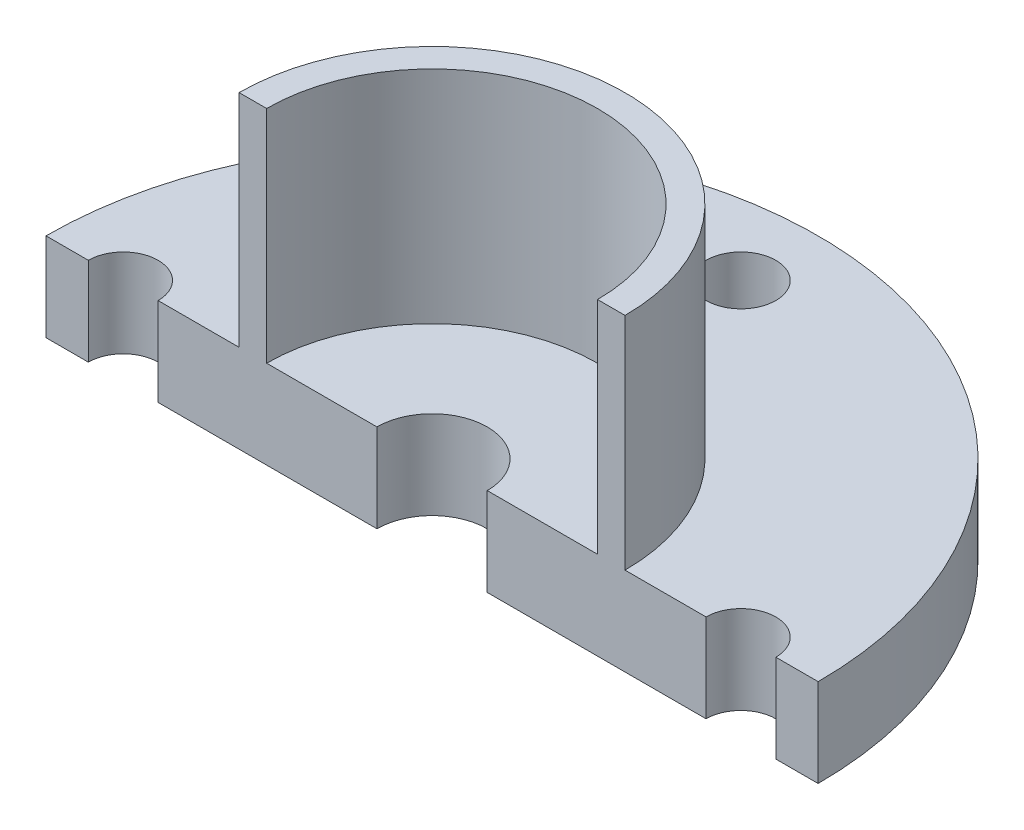
ISO-10303-21;
HEADER;
FILE_DESCRIPTION(('STEP AP214'),'2;1');
FILE_NAME('part.step','',(''),(''),'','','');
FILE_SCHEMA(('AUTOMOTIVE_DESIGN { 1 0 10303 214 1 1 1 1 }'));
ENDSEC;
DATA;
#1=APPLICATION_CONTEXT('core data for automotive mechanical design processes');
#2=APPLICATION_PROTOCOL_DEFINITION('international standard','automotive_design',2000,#1);
#3=PRODUCT_CONTEXT('',#1,'mechanical');
#4=PRODUCT('Part','Part','',(#3));
#5=PRODUCT_RELATED_PRODUCT_CATEGORY('part','',(#4));
#6=PRODUCT_DEFINITION_FORMATION('','',#4);
#7=PRODUCT_DEFINITION_CONTEXT('part definition',#1,'design');
#8=PRODUCT_DEFINITION('design','',#6,#7);
#9=PRODUCT_DEFINITION_SHAPE('','',#8);
#10=(LENGTH_UNIT() NAMED_UNIT(*) SI_UNIT(.MILLI.,.METRE.));
#11=(NAMED_UNIT(*) PLANE_ANGLE_UNIT() SI_UNIT($,.RADIAN.));
#12=(NAMED_UNIT(*) SI_UNIT($,.STERADIAN.) SOLID_ANGLE_UNIT());
#13=UNCERTAINTY_MEASURE_WITH_UNIT(LENGTH_MEASURE(1.E-05),#10,'distance_accuracy_value','');
#14=(GEOMETRIC_REPRESENTATION_CONTEXT(3) GLOBAL_UNCERTAINTY_ASSIGNED_CONTEXT((#13)) GLOBAL_UNIT_ASSIGNED_CONTEXT((#10,
#11,#12)) REPRESENTATION_CONTEXT('',''));
#15=CARTESIAN_POINT('',(0.,0.,0.));
#16=DIRECTION('',(0.,0.,1.));
#17=DIRECTION('',(1.,0.,0.));
#18=AXIS2_PLACEMENT_3D('',#15,#16,#17);
#19=CARTESIAN_POINT('',(0.,8.,0.));
#20=DIRECTION('',(0.,1.,0.));
#21=DIRECTION('',(0.,0.,1.));
#22=AXIS2_PLACEMENT_3D('',#19,#20,#21);
#23=PLANE('',#22);
#24=CARTESIAN_POINT('',(0.,8.,0.));
#25=DIRECTION('',(0.,1.,0.));
#26=DIRECTION('',(0.,0.,1.));
#27=AXIS2_PLACEMENT_3D('',#24,#25,#26);
#28=CIRCLE('',#27,15.);
#29=CARTESIAN_POINT('',(15.,8.,0.));
#30=VERTEX_POINT('',#29);
#31=CARTESIAN_POINT('',(-15.,8.,0.));
#32=VERTEX_POINT('',#31);
#33=EDGE_CURVE('E133',#30,#32,#28,.T.);
#34=ORIENTED_EDGE('',*,*,#33,.T.);
#35=DIRECTION('',(1.,0.,0.));
#36=VECTOR('',#35,1.);
#37=CARTESIAN_POINT('',(0.,8.,0.));
#38=LINE('',#37,#36);
#39=CARTESIAN_POINT('',(-5.,8.,0.));
#40=VERTEX_POINT('',#39);
#41=EDGE_CURVE('E150',#32,#40,#38,.T.);
#42=ORIENTED_EDGE('',*,*,#41,.T.);
#43=CARTESIAN_POINT('',(0.,8.,0.));
#44=DIRECTION('',(0.,1.,0.));
#45=DIRECTION('',(0.,0.,1.));
#46=AXIS2_PLACEMENT_3D('',#43,#44,#45);
#47=CIRCLE('',#46,5.);
#48=CARTESIAN_POINT('',(5.,8.,0.));
#49=VERTEX_POINT('',#48);
#50=EDGE_CURVE('E174',#49,#40,#47,.T.);
#51=ORIENTED_EDGE('',*,*,#50,.F.);
#52=EDGE_CURVE('E180',#49,#30,#38,.T.);
#53=ORIENTED_EDGE('',*,*,#52,.T.);
#54=EDGE_LOOP('',(#34,#42,#51,#53));
#55=FACE_BOUND('',#54,.T.);
#56=ADVANCED_FACE('F34',(#55),#23,.T.);
#57=CARTESIAN_POINT('',(1.95523068222125E-13,8.,-28.));
#58=DIRECTION('',(0.,1.,0.));
#59=DIRECTION('',(0.,0.,1.));
#60=AXIS2_PLACEMENT_3D('',#57,#58,#59);
#61=CIRCLE('',#60,3.16227766016838);
#62=CARTESIAN_POINT('',(1.95523068222125E-13,8.,-24.8377223398316));
#63=VERTEX_POINT('',#62);
#64=EDGE_CURVE('E132',#63,#63,#61,.T.);
#65=ORIENTED_EDGE('',*,*,#64,.F.);
#66=EDGE_LOOP('',(#65));
#67=FACE_BOUND('',#66,.T.);
#68=CARTESIAN_POINT('',(0.,8.,0.));
#69=DIRECTION('',(0.,1.,0.));
#70=DIRECTION('',(0.,0.,1.));
#71=AXIS2_PLACEMENT_3D('',#68,#69,#70);
#72=CIRCLE('',#71,35.);
#73=CARTESIAN_POINT('',(35.,8.,0.));
#74=VERTEX_POINT('',#73);
#75=CARTESIAN_POINT('',(-35.,8.,0.));
#76=VERTEX_POINT('',#75);
#77=EDGE_CURVE('E177',#74,#76,#72,.T.);
#78=ORIENTED_EDGE('',*,*,#77,.T.);
#79=DIRECTION('',(1.,0.,0.));
#80=VECTOR('',#79,1.);
#81=CARTESIAN_POINT('',(0.,8.,0.));
#82=LINE('',#81,#80);
#83=CARTESIAN_POINT('',(-31.1622776601684,8.,0.));
#84=VERTEX_POINT('',#83);
#85=EDGE_CURVE('E55',#76,#84,#82,.T.);
#86=ORIENTED_EDGE('',*,*,#85,.T.);
#87=CARTESIAN_POINT('',(-28.,8.,0.));
#88=DIRECTION('',(0.,1.,0.));
#89=DIRECTION('',(0.,0.,1.));
#90=AXIS2_PLACEMENT_3D('',#87,#88,#89);
#91=CIRCLE('',#90,3.16227766016838);
#92=CARTESIAN_POINT('',(-24.8377223398316,8.,0.));
#93=VERTEX_POINT('',#92);
#94=EDGE_CURVE('E152',#93,#84,#91,.T.);
#95=ORIENTED_EDGE('',*,*,#94,.F.);
#96=CARTESIAN_POINT('',(-17.4928556845359,8.,0.));
#97=VERTEX_POINT('',#96);
#98=EDGE_CURVE('E166',#93,#97,#82,.T.);
#99=ORIENTED_EDGE('',*,*,#98,.T.);
#100=CARTESIAN_POINT('',(0.,8.,0.));
#101=DIRECTION('',(0.,1.,0.));
#102=DIRECTION('',(0.,0.,1.));
#103=AXIS2_PLACEMENT_3D('',#100,#101,#102);
#104=CIRCLE('',#103,17.4928556845359);
#105=CARTESIAN_POINT('',(17.4928556845359,8.,0.));
#106=VERTEX_POINT('',#105);
#107=EDGE_CURVE('E137',#106,#97,#104,.T.);
#108=ORIENTED_EDGE('',*,*,#107,.F.);
#109=CARTESIAN_POINT('',(24.8377223398316,8.,0.));
#110=VERTEX_POINT('',#109);
#111=EDGE_CURVE('E163',#106,#110,#82,.T.);
#112=ORIENTED_EDGE('',*,*,#111,.T.);
#113=CARTESIAN_POINT('',(28.,8.,2.93284602333188E-13));
#114=DIRECTION('',(0.,1.,0.));
#115=DIRECTION('',(0.,0.,1.));
#116=AXIS2_PLACEMENT_3D('',#113,#114,#115);
#117=CIRCLE('',#116,3.16227766016838);
#118=CARTESIAN_POINT('',(31.1622776601684,8.,0.));
#119=VERTEX_POINT('',#118);
#120=EDGE_CURVE('E158',#119,#110,#117,.T.);
#121=ORIENTED_EDGE('',*,*,#120,.F.);
#122=EDGE_CURVE('E167',#119,#74,#82,.T.);
#123=ORIENTED_EDGE('',*,*,#122,.T.);
#124=EDGE_LOOP('',(#78,#86,#95,#99,#108,#112,#121,#123));
#125=FACE_BOUND('',#124,.T.);
#126=ADVANCED_FACE('F220',(#67,#125),#23,.T.);
#127=CARTESIAN_POINT('',(0.,0.,0.));
#128=DIRECTION('',(0.,1.,0.));
#129=DIRECTION('',(0.,0.,1.));
#130=AXIS2_PLACEMENT_3D('',#127,#128,#129);
#131=PLANE('',#130);
#132=CARTESIAN_POINT('',(1.95523068222125E-13,0.,-28.));
#133=DIRECTION('',(0.,1.,0.));
#134=DIRECTION('',(0.,0.,1.));
#135=AXIS2_PLACEMENT_3D('',#132,#133,#134);
#136=CIRCLE('',#135,3.16227766016838);
#137=CARTESIAN_POINT('',(1.95523068222125E-13,0.,-24.8377223398316));
#138=VERTEX_POINT('',#137);
#139=EDGE_CURVE('E198',#138,#138,#136,.T.);
#140=ORIENTED_EDGE('',*,*,#139,.T.);
#141=EDGE_LOOP('',(#140));
#142=FACE_BOUND('',#141,.T.);
#143=DIRECTION('',(-1.,0.,0.));
#144=VECTOR('',#143,1.);
#145=CARTESIAN_POINT('',(-37.,0.,0.));
#146=LINE('',#145,#144);
#147=CARTESIAN_POINT('',(-31.1622776601684,0.,0.));
#148=VERTEX_POINT('',#147);
#149=CARTESIAN_POINT('',(-35.,0.,0.));
#150=VERTEX_POINT('',#149);
#151=EDGE_CURVE('E190',#148,#150,#146,.T.);
#152=ORIENTED_EDGE('',*,*,#151,.T.);
#153=CARTESIAN_POINT('',(0.,0.,0.));
#154=DIRECTION('',(0.,1.,0.));
#155=DIRECTION('',(0.,0.,1.));
#156=AXIS2_PLACEMENT_3D('',#153,#154,#155);
#157=CIRCLE('',#156,35.);
#158=CARTESIAN_POINT('',(35.,0.,0.));
#159=VERTEX_POINT('',#158);
#160=EDGE_CURVE('E36',#159,#150,#157,.T.);
#161=ORIENTED_EDGE('',*,*,#160,.F.);
#162=CARTESIAN_POINT('',(31.1622776601684,0.,0.));
#163=VERTEX_POINT('',#162);
#164=EDGE_CURVE('E182',#159,#163,#146,.T.);
#165=ORIENTED_EDGE('',*,*,#164,.T.);
#166=CARTESIAN_POINT('',(28.,0.,2.93284602333188E-13));
#167=DIRECTION('',(0.,1.,0.));
#168=DIRECTION('',(0.,0.,1.));
#169=AXIS2_PLACEMENT_3D('',#166,#167,#168);
#170=CIRCLE('',#169,3.16227766016838);
#171=CARTESIAN_POINT('',(24.8377223398316,0.,0.));
#172=VERTEX_POINT('',#171);
#173=EDGE_CURVE('E186',#163,#172,#170,.T.);
#174=ORIENTED_EDGE('',*,*,#173,.T.);
#175=CARTESIAN_POINT('',(5.,0.,0.));
#176=VERTEX_POINT('',#175);
#177=EDGE_CURVE('E187',#172,#176,#146,.T.);
#178=ORIENTED_EDGE('',*,*,#177,.T.);
#179=CARTESIAN_POINT('',(0.,0.,0.));
#180=DIRECTION('',(0.,1.,0.));
#181=DIRECTION('',(0.,0.,1.));
#182=AXIS2_PLACEMENT_3D('',#179,#180,#181);
#183=CIRCLE('',#182,5.);
#184=CARTESIAN_POINT('',(-5.,0.,0.));
#185=VERTEX_POINT('',#184);
#186=EDGE_CURVE('E221',#176,#185,#183,.T.);
#187=ORIENTED_EDGE('',*,*,#186,.T.);
#188=CARTESIAN_POINT('',(-24.8377223398316,0.,0.));
#189=VERTEX_POINT('',#188);
#190=EDGE_CURVE('E204',#185,#189,#146,.T.);
#191=ORIENTED_EDGE('',*,*,#190,.T.);
#192=CARTESIAN_POINT('',(-28.,0.,0.));
#193=DIRECTION('',(0.,1.,0.));
#194=DIRECTION('',(0.,0.,1.));
#195=AXIS2_PLACEMENT_3D('',#192,#193,#194);
#196=CIRCLE('',#195,3.16227766016838);
#197=EDGE_CURVE('E185',#189,#148,#196,.T.);
#198=ORIENTED_EDGE('',*,*,#197,.T.);
#199=EDGE_LOOP('',(#152,#161,#165,#174,#178,#187,#191,#198));
#200=FACE_BOUND('',#199,.T.);
#201=ADVANCED_FACE('F229',(#142,#200),#131,.F.);
#202=CARTESIAN_POINT('',(0.,8.,0.));
#203=DIRECTION('',(0.,-1.,0.));
#204=DIRECTION('',(0.,0.,-1.));
#205=AXIS2_PLACEMENT_3D('',#202,#203,#204);
#206=CYLINDRICAL_SURFACE('',#205,35.);
#207=DIRECTION('',(0.,-1.,0.));
#208=VECTOR('',#207,1.);
#209=CARTESIAN_POINT('',(-35.,8.,0.));
#210=LINE('',#209,#208);
#211=EDGE_CURVE('E11',#76,#150,#210,.T.);
#212=ORIENTED_EDGE('',*,*,#211,.F.);
#213=ORIENTED_EDGE('',*,*,#77,.F.);
#214=DIRECTION('',(0.,-1.,0.));
#215=VECTOR('',#214,1.);
#216=CARTESIAN_POINT('',(35.,28.,0.));
#217=LINE('',#216,#215);
#218=EDGE_CURVE('E179',#74,#159,#217,.T.);
#219=ORIENTED_EDGE('',*,*,#218,.T.);
#220=ORIENTED_EDGE('',*,*,#160,.T.);
#221=EDGE_LOOP('',(#212,#213,#219,#220));
#222=FACE_BOUND('',#221,.T.);
#223=ADVANCED_FACE('F252',(#222),#206,.T.);
#224=CARTESIAN_POINT('',(0.,8.,0.));
#225=DIRECTION('',(0.,-1.,0.));
#226=DIRECTION('',(0.,0.,-1.));
#227=AXIS2_PLACEMENT_3D('',#224,#225,#226);
#228=CYLINDRICAL_SURFACE('',#227,5.);
#229=ORIENTED_EDGE('',*,*,#50,.T.);
#230=DIRECTION('',(0.,-1.,0.));
#231=VECTOR('',#230,1.);
#232=CARTESIAN_POINT('',(-5.,8.,0.));
#233=LINE('',#232,#231);
#234=EDGE_CURVE('E169',#40,#185,#233,.T.);
#235=ORIENTED_EDGE('',*,*,#234,.T.);
#236=ORIENTED_EDGE('',*,*,#186,.F.);
#237=DIRECTION('',(0.,-1.,0.));
#238=VECTOR('',#237,1.);
#239=CARTESIAN_POINT('',(5.,8.,0.));
#240=LINE('',#239,#238);
#241=EDGE_CURVE('E171',#176,#49,#240,.F.);
#242=ORIENTED_EDGE('',*,*,#241,.T.);
#243=EDGE_LOOP('',(#229,#235,#236,#242));
#244=FACE_BOUND('',#243,.T.);
#245=ADVANCED_FACE('F233',(#244),#228,.F.);
#246=CARTESIAN_POINT('',(-28.,8.,0.));
#247=DIRECTION('',(0.,-1.,0.));
#248=DIRECTION('',(0.,0.,-1.));
#249=AXIS2_PLACEMENT_3D('',#246,#247,#248);
#250=CYLINDRICAL_SURFACE('',#249,3.16227766016838);
#251=ORIENTED_EDGE('',*,*,#94,.T.);
#252=DIRECTION('',(0.,-1.,0.));
#253=VECTOR('',#252,1.);
#254=CARTESIAN_POINT('',(-31.1622776601684,8.,0.));
#255=LINE('',#254,#253);
#256=EDGE_CURVE('E146',#84,#148,#255,.T.);
#257=ORIENTED_EDGE('',*,*,#256,.T.);
#258=ORIENTED_EDGE('',*,*,#197,.F.);
#259=DIRECTION('',(0.,-1.,0.));
#260=VECTOR('',#259,1.);
#261=CARTESIAN_POINT('',(-24.8377223398316,8.,0.));
#262=LINE('',#261,#260);
#263=EDGE_CURVE('E154',#189,#93,#262,.F.);
#264=ORIENTED_EDGE('',*,*,#263,.T.);
#265=EDGE_LOOP('',(#251,#257,#258,#264));
#266=FACE_BOUND('',#265,.T.);
#267=ADVANCED_FACE('F241',(#266),#250,.F.);
#268=CARTESIAN_POINT('',(28.,8.,2.93284602333188E-13));
#269=DIRECTION('',(0.,-1.,0.));
#270=DIRECTION('',(0.,0.,-1.));
#271=AXIS2_PLACEMENT_3D('',#268,#269,#270);
#272=CYLINDRICAL_SURFACE('',#271,3.16227766016838);
#273=ORIENTED_EDGE('',*,*,#120,.T.);
#274=DIRECTION('',(0.,-1.,0.));
#275=VECTOR('',#274,1.);
#276=CARTESIAN_POINT('',(24.8377223398316,8.,0.));
#277=LINE('',#276,#275);
#278=EDGE_CURVE('E160',#110,#172,#277,.T.);
#279=ORIENTED_EDGE('',*,*,#278,.T.);
#280=ORIENTED_EDGE('',*,*,#173,.F.);
#281=DIRECTION('',(0.,-1.,0.));
#282=VECTOR('',#281,1.);
#283=CARTESIAN_POINT('',(31.1622776601684,8.,0.));
#284=LINE('',#283,#282);
#285=EDGE_CURVE('E155',#163,#119,#284,.F.);
#286=ORIENTED_EDGE('',*,*,#285,.T.);
#287=EDGE_LOOP('',(#273,#279,#280,#286));
#288=FACE_BOUND('',#287,.T.);
#289=ADVANCED_FACE('F250',(#288),#272,.F.);
#290=CARTESIAN_POINT('',(0.,28.,0.));
#291=DIRECTION('',(0.,1.,0.));
#292=DIRECTION('',(0.,0.,1.));
#293=AXIS2_PLACEMENT_3D('',#290,#291,#292);
#294=PLANE('',#293);
#295=CARTESIAN_POINT('',(0.,28.,0.));
#296=DIRECTION('',(0.,1.,0.));
#297=DIRECTION('',(0.,0.,1.));
#298=AXIS2_PLACEMENT_3D('',#295,#296,#297);
#299=CIRCLE('',#298,17.4928556845359);
#300=CARTESIAN_POINT('',(17.4928556845359,28.,0.));
#301=VERTEX_POINT('',#300);
#302=CARTESIAN_POINT('',(-17.4928556845359,28.,0.));
#303=VERTEX_POINT('',#302);
#304=EDGE_CURVE('E142',#301,#303,#299,.T.);
#305=ORIENTED_EDGE('',*,*,#304,.T.);
#306=DIRECTION('',(-1.,0.,0.));
#307=VECTOR('',#306,1.);
#308=CARTESIAN_POINT('',(-37.,28.,0.));
#309=LINE('',#308,#307);
#310=CARTESIAN_POINT('',(-15.,28.,0.));
#311=VERTEX_POINT('',#310);
#312=EDGE_CURVE('E125',#311,#303,#309,.T.);
#313=ORIENTED_EDGE('',*,*,#312,.F.);
#314=CARTESIAN_POINT('',(0.,28.,0.));
#315=DIRECTION('',(0.,1.,0.));
#316=DIRECTION('',(0.,0.,1.));
#317=AXIS2_PLACEMENT_3D('',#314,#315,#316);
#318=CIRCLE('',#317,15.);
#319=CARTESIAN_POINT('',(15.,28.,0.));
#320=VERTEX_POINT('',#319);
#321=EDGE_CURVE('E131',#320,#311,#318,.T.);
#322=ORIENTED_EDGE('',*,*,#321,.F.);
#323=EDGE_CURVE('E113',#301,#320,#309,.T.);
#324=ORIENTED_EDGE('',*,*,#323,.F.);
#325=EDGE_LOOP('',(#305,#313,#322,#324));
#326=FACE_BOUND('',#325,.T.);
#327=ADVANCED_FACE('F138',(#326),#294,.T.);
#328=CARTESIAN_POINT('',(0.,28.,0.));
#329=DIRECTION('',(0.,-1.,0.));
#330=DIRECTION('',(0.,0.,-1.));
#331=AXIS2_PLACEMENT_3D('',#328,#329,#330);
#332=CYLINDRICAL_SURFACE('',#331,17.4928556845359);
#333=DIRECTION('',(0.,-1.,0.));
#334=VECTOR('',#333,1.);
#335=CARTESIAN_POINT('',(-17.4928556845359,28.,0.));
#336=LINE('',#335,#334);
#337=EDGE_CURVE('E42',#303,#97,#336,.T.);
#338=ORIENTED_EDGE('',*,*,#337,.F.);
#339=ORIENTED_EDGE('',*,*,#304,.F.);
#340=DIRECTION('',(0.,-1.,0.));
#341=VECTOR('',#340,1.);
#342=CARTESIAN_POINT('',(17.4928556845359,28.,0.));
#343=LINE('',#342,#341);
#344=EDGE_CURVE('E111',#106,#301,#343,.F.);
#345=ORIENTED_EDGE('',*,*,#344,.F.);
#346=ORIENTED_EDGE('',*,*,#107,.T.);
#347=EDGE_LOOP('',(#338,#339,#345,#346));
#348=FACE_BOUND('',#347,.T.);
#349=ADVANCED_FACE('F211',(#348),#332,.T.);
#350=CARTESIAN_POINT('',(0.,28.,0.));
#351=DIRECTION('',(0.,-1.,0.));
#352=DIRECTION('',(0.,0.,-1.));
#353=AXIS2_PLACEMENT_3D('',#350,#351,#352);
#354=CYLINDRICAL_SURFACE('',#353,15.);
#355=ORIENTED_EDGE('',*,*,#321,.T.);
#356=DIRECTION('',(0.,-1.,0.));
#357=VECTOR('',#356,1.);
#358=CARTESIAN_POINT('',(-15.,28.,0.));
#359=LINE('',#358,#357);
#360=EDGE_CURVE('E134',#311,#32,#359,.T.);
#361=ORIENTED_EDGE('',*,*,#360,.T.);
#362=ORIENTED_EDGE('',*,*,#33,.F.);
#363=DIRECTION('',(0.,-1.,0.));
#364=VECTOR('',#363,1.);
#365=CARTESIAN_POINT('',(15.,28.,0.));
#366=LINE('',#365,#364);
#367=EDGE_CURVE('E120',#30,#320,#366,.F.);
#368=ORIENTED_EDGE('',*,*,#367,.T.);
#369=EDGE_LOOP('',(#355,#361,#362,#368));
#370=FACE_BOUND('',#369,.T.);
#371=ADVANCED_FACE('F129',(#370),#354,.F.);
#372=CARTESIAN_POINT('',(1.95523068222125E-13,8.,-28.));
#373=DIRECTION('',(0.,-1.,0.));
#374=DIRECTION('',(0.,0.,-1.));
#375=AXIS2_PLACEMENT_3D('',#372,#373,#374);
#376=CYLINDRICAL_SURFACE('',#375,3.16227766016838);
#377=ORIENTED_EDGE('',*,*,#64,.T.);
#378=EDGE_LOOP('',(#377));
#379=FACE_BOUND('',#378,.T.);
#380=ORIENTED_EDGE('',*,*,#139,.F.);
#381=EDGE_LOOP('',(#380));
#382=FACE_BOUND('',#381,.T.);
#383=ADVANCED_FACE('F267',(#379,#382),#376,.F.);
#384=CARTESIAN_POINT('',(-37.,28.,0.));
#385=DIRECTION('',(0.,0.,1.));
#386=DIRECTION('',(1.,0.,0.));
#387=AXIS2_PLACEMENT_3D('',#384,#385,#386);
#388=PLANE('',#387);
#389=ORIENTED_EDGE('',*,*,#111,.F.);
#390=ORIENTED_EDGE('',*,*,#344,.T.);
#391=ORIENTED_EDGE('',*,*,#323,.T.);
#392=ORIENTED_EDGE('',*,*,#367,.F.);
#393=ORIENTED_EDGE('',*,*,#52,.F.);
#394=ORIENTED_EDGE('',*,*,#241,.F.);
#395=ORIENTED_EDGE('',*,*,#177,.F.);
#396=ORIENTED_EDGE('',*,*,#278,.F.);
#397=EDGE_LOOP('',(#389,#390,#391,#392,#393,#394,#395,#396));
#398=FACE_BOUND('',#397,.T.);
#399=ADVANCED_FACE('F116',(#398),#388,.T.);
#400=ORIENTED_EDGE('',*,*,#190,.F.);
#401=ORIENTED_EDGE('',*,*,#234,.F.);
#402=ORIENTED_EDGE('',*,*,#41,.F.);
#403=ORIENTED_EDGE('',*,*,#360,.F.);
#404=ORIENTED_EDGE('',*,*,#312,.T.);
#405=ORIENTED_EDGE('',*,*,#337,.T.);
#406=ORIENTED_EDGE('',*,*,#98,.F.);
#407=ORIENTED_EDGE('',*,*,#263,.F.);
#408=EDGE_LOOP('',(#400,#401,#402,#403,#404,#405,#406,#407));
#409=FACE_BOUND('',#408,.T.);
#410=ADVANCED_FACE('F218',(#409),#388,.T.);
#411=ORIENTED_EDGE('',*,*,#285,.F.);
#412=ORIENTED_EDGE('',*,*,#164,.F.);
#413=ORIENTED_EDGE('',*,*,#218,.F.);
#414=ORIENTED_EDGE('',*,*,#122,.F.);
#415=EDGE_LOOP('',(#411,#412,#413,#414));
#416=FACE_BOUND('',#415,.T.);
#417=ADVANCED_FACE('F290',(#416),#388,.T.);
#418=ORIENTED_EDGE('',*,*,#211,.T.);
#419=ORIENTED_EDGE('',*,*,#151,.F.);
#420=ORIENTED_EDGE('',*,*,#256,.F.);
#421=ORIENTED_EDGE('',*,*,#85,.F.);
#422=EDGE_LOOP('',(#418,#419,#420,#421));
#423=FACE_BOUND('',#422,.T.);
#424=ADVANCED_FACE('F244',(#423),#388,.T.);
#425=CLOSED_SHELL('',(#56,#126,#201,#223,#245,#267,#289,#327,#349,#371,#383,#399,#410,#417,#424));
#426=MANIFOLD_SOLID_BREP('B2',#425);
#427=ADVANCED_BREP_SHAPE_REPRESENTATION('',(#18,#426),#14);
#428=SHAPE_DEFINITION_REPRESENTATION(#9,#427);
ENDSEC;
END-ISO-10303-21;
